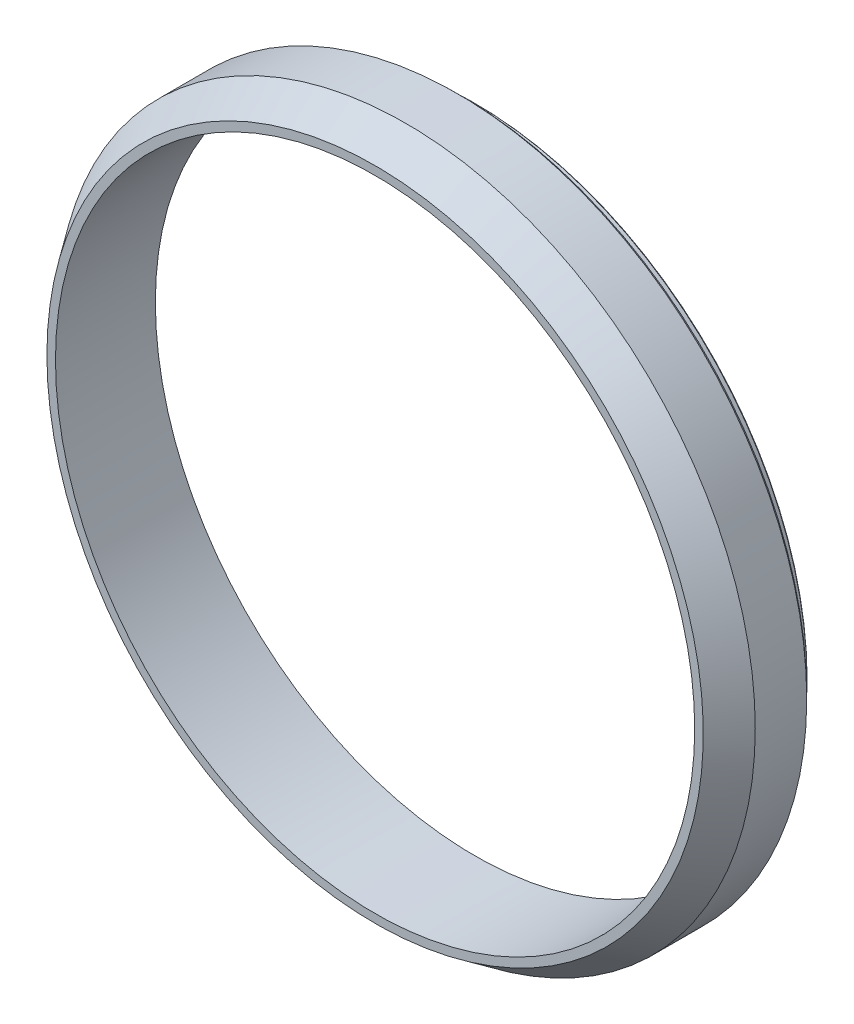
ISO-10303-21;
HEADER;
FILE_DESCRIPTION(('STEP AP214'),'2;1');
FILE_NAME('part.step','',(''),(''),'','','');
FILE_SCHEMA(('AUTOMOTIVE_DESIGN { 1 0 10303 214 1 1 1 1 }'));
ENDSEC;
DATA;
#1=APPLICATION_CONTEXT('core data for automotive mechanical design processes');
#2=APPLICATION_PROTOCOL_DEFINITION('international standard','automotive_design',2000,#1);
#3=PRODUCT_CONTEXT('',#1,'mechanical');
#4=PRODUCT('Part','Part','',(#3));
#5=PRODUCT_RELATED_PRODUCT_CATEGORY('part','',(#4));
#6=PRODUCT_DEFINITION_FORMATION('','',#4);
#7=PRODUCT_DEFINITION_CONTEXT('part definition',#1,'design');
#8=PRODUCT_DEFINITION('design','',#6,#7);
#9=PRODUCT_DEFINITION_SHAPE('','',#8);
#10=(LENGTH_UNIT() NAMED_UNIT(*) SI_UNIT(.MILLI.,.METRE.));
#11=(NAMED_UNIT(*) PLANE_ANGLE_UNIT() SI_UNIT($,.RADIAN.));
#12=(NAMED_UNIT(*) SI_UNIT($,.STERADIAN.) SOLID_ANGLE_UNIT());
#13=UNCERTAINTY_MEASURE_WITH_UNIT(LENGTH_MEASURE(1.E-05),#10,'distance_accuracy_value','');
#14=(GEOMETRIC_REPRESENTATION_CONTEXT(3) GLOBAL_UNCERTAINTY_ASSIGNED_CONTEXT((#13)) GLOBAL_UNIT_ASSIGNED_CONTEXT((#10,
#11,#12)) REPRESENTATION_CONTEXT('',''));
#15=CARTESIAN_POINT('',(0.,0.,0.));
#16=DIRECTION('',(0.,0.,1.));
#17=DIRECTION('',(1.,0.,0.));
#18=AXIS2_PLACEMENT_3D('',#15,#16,#17);
#19=CARTESIAN_POINT('',(46.8,0.,-14.));
#20=DIRECTION('',(0.,0.,1.));
#21=DIRECTION('',(1.,0.,0.));
#22=AXIS2_PLACEMENT_3D('',#19,#20,#21);
#23=PLANE('',#22);
#24=CARTESIAN_POINT('',(0.,0.,-14.));
#25=DIRECTION('',(0.,0.,1.));
#26=DIRECTION('',(1.,0.,0.));
#27=AXIS2_PLACEMENT_3D('',#24,#25,#26);
#28=CIRCLE('',#27,46.55);
#29=CARTESIAN_POINT('',(46.55,0.,-14.));
#30=VERTEX_POINT('',#29);
#31=EDGE_CURVE('E65',#30,#30,#28,.F.);
#32=ORIENTED_EDGE('',*,*,#31,.T.);
#33=EDGE_LOOP('',(#32));
#34=FACE_BOUND('',#33,.T.);
#35=CARTESIAN_POINT('',(0.,0.,-14.));
#36=DIRECTION('',(0.,0.,-1.));
#37=DIRECTION('',(-1.,0.,0.));
#38=AXIS2_PLACEMENT_3D('',#35,#36,#37);
#39=CIRCLE('',#38,44.8);
#40=CARTESIAN_POINT('',(-44.8,0.,-14.));
#41=VERTEX_POINT('',#40);
#42=EDGE_CURVE('E69',#41,#41,#39,.T.);
#43=ORIENTED_EDGE('',*,*,#42,.F.);
#44=EDGE_LOOP('',(#43));
#45=FACE_BOUND('',#44,.T.);
#46=ADVANCED_FACE('F37',(#34,#45),#23,.F.);
#47=CARTESIAN_POINT('',(0.,0.,-51.2755102040816));
#48=DIRECTION('',(0.,0.,-1.));
#49=DIRECTION('',(-1.,0.,0.));
#50=AXIS2_PLACEMENT_3D('',#47,#48,#49);
#51=CYLINDRICAL_SURFACE('',#50,44.8);
#52=CARTESIAN_POINT('',(0.,0.,0.));
#53=DIRECTION('',(0.,0.,-1.));
#54=DIRECTION('',(-1.,0.,0.));
#55=AXIS2_PLACEMENT_3D('',#52,#53,#54);
#56=CIRCLE('',#55,44.8);
#57=CARTESIAN_POINT('',(-44.8,0.,0.));
#58=VERTEX_POINT('',#57);
#59=EDGE_CURVE('E73',#58,#58,#56,.T.);
#60=ORIENTED_EDGE('',*,*,#59,.F.);
#61=EDGE_LOOP('',(#60));
#62=FACE_BOUND('',#61,.T.);
#63=ORIENTED_EDGE('',*,*,#42,.T.);
#64=EDGE_LOOP('',(#63));
#65=FACE_BOUND('',#64,.T.);
#66=ADVANCED_FACE('F99',(#62,#65),#51,.F.);
#67=CARTESIAN_POINT('',(44.8,0.,0.));
#68=DIRECTION('',(0.,0.,-1.));
#69=DIRECTION('',(-1.,0.,0.));
#70=AXIS2_PLACEMENT_3D('',#67,#68,#69);
#71=PLANE('',#70);
#72=CARTESIAN_POINT('',(0.,0.,0.));
#73=DIRECTION('',(0.,0.,-1.));
#74=DIRECTION('',(-1.,0.,0.));
#75=AXIS2_PLACEMENT_3D('',#72,#73,#74);
#76=CIRCLE('',#75,46.);
#77=CARTESIAN_POINT('',(-46.,0.,0.));
#78=VERTEX_POINT('',#77);
#79=EDGE_CURVE('E10',#78,#78,#76,.F.);
#80=ORIENTED_EDGE('',*,*,#79,.T.);
#81=EDGE_LOOP('',(#80));
#82=FACE_BOUND('',#81,.T.);
#83=ORIENTED_EDGE('',*,*,#59,.T.);
#84=EDGE_LOOP('',(#83));
#85=FACE_BOUND('',#84,.T.);
#86=ADVANCED_FACE('F96',(#82,#85),#71,.F.);
#87=CARTESIAN_POINT('',(0.,0.,-51.2755102040816));
#88=DIRECTION('',(0.,0.,-1.));
#89=DIRECTION('',(-1.,0.,0.));
#90=AXIS2_PLACEMENT_3D('',#87,#88,#89);
#91=CYLINDRICAL_SURFACE('',#90,49.);
#92=CARTESIAN_POINT('',(0.,0.,-4.28444402022632));
#93=DIRECTION('',(0.,0.,-1.));
#94=DIRECTION('',(-1.,0.,0.));
#95=AXIS2_PLACEMENT_3D('',#92,#93,#94);
#96=CIRCLE('',#95,49.);
#97=CARTESIAN_POINT('',(-49.,0.,-4.28444402022632));
#98=VERTEX_POINT('',#97);
#99=EDGE_CURVE('E45',#98,#98,#96,.T.);
#100=ORIENTED_EDGE('',*,*,#99,.T.);
#101=EDGE_LOOP('',(#100));
#102=FACE_BOUND('',#101,.T.);
#103=CARTESIAN_POINT('',(0.,0.,-11.5));
#104=DIRECTION('',(0.,0.,1.));
#105=DIRECTION('',(1.,0.,0.));
#106=AXIS2_PLACEMENT_3D('',#103,#104,#105);
#107=CIRCLE('',#106,49.);
#108=CARTESIAN_POINT('',(49.,0.,-11.5));
#109=VERTEX_POINT('',#108);
#110=EDGE_CURVE('E50',#109,#109,#107,.T.);
#111=ORIENTED_EDGE('',*,*,#110,.T.);
#112=EDGE_LOOP('',(#111));
#113=FACE_BOUND('',#112,.T.);
#114=ADVANCED_FACE('F86',(#102,#113),#91,.T.);
#115=CARTESIAN_POINT('',(49.,0.,-12.));
#116=DIRECTION('',(0.,0.,1.));
#117=DIRECTION('',(1.,0.,0.));
#118=AXIS2_PLACEMENT_3D('',#115,#116,#117);
#119=PLANE('',#118);
#120=CARTESIAN_POINT('',(0.,0.,-12.));
#121=DIRECTION('',(0.,0.,1.));
#122=DIRECTION('',(1.,0.,0.));
#123=AXIS2_PLACEMENT_3D('',#120,#121,#122);
#124=CIRCLE('',#123,48.5);
#125=CARTESIAN_POINT('',(48.5,0.,-12.));
#126=VERTEX_POINT('',#125);
#127=EDGE_CURVE('E55',#126,#126,#124,.F.);
#128=ORIENTED_EDGE('',*,*,#127,.T.);
#129=EDGE_LOOP('',(#128));
#130=FACE_BOUND('',#129,.T.);
#131=CARTESIAN_POINT('',(0.,0.,-12.));
#132=DIRECTION('',(0.,0.,-1.));
#133=DIRECTION('',(-1.,0.,0.));
#134=AXIS2_PLACEMENT_3D('',#131,#132,#133);
#135=CIRCLE('',#134,46.8);
#136=CARTESIAN_POINT('',(-46.8,0.,-12.));
#137=VERTEX_POINT('',#136);
#138=EDGE_CURVE('E77',#137,#137,#135,.T.);
#139=ORIENTED_EDGE('',*,*,#138,.F.);
#140=EDGE_LOOP('',(#139));
#141=FACE_BOUND('',#140,.T.);
#142=ADVANCED_FACE('F84',(#130,#141),#119,.F.);
#143=CARTESIAN_POINT('',(0.,0.,-51.2755102040816));
#144=DIRECTION('',(0.,0.,-1.));
#145=DIRECTION('',(-1.,0.,0.));
#146=AXIS2_PLACEMENT_3D('',#143,#144,#145);
#147=CYLINDRICAL_SURFACE('',#146,46.8);
#148=CARTESIAN_POINT('',(0.,0.,-13.75));
#149=DIRECTION('',(0.,0.,1.));
#150=DIRECTION('',(1.,0.,0.));
#151=AXIS2_PLACEMENT_3D('',#148,#149,#150);
#152=CIRCLE('',#151,46.8);
#153=CARTESIAN_POINT('',(46.8,0.,-13.75));
#154=VERTEX_POINT('',#153);
#155=EDGE_CURVE('E61',#154,#154,#152,.T.);
#156=ORIENTED_EDGE('',*,*,#155,.T.);
#157=EDGE_LOOP('',(#156));
#158=FACE_BOUND('',#157,.T.);
#159=ORIENTED_EDGE('',*,*,#138,.T.);
#160=EDGE_LOOP('',(#159));
#161=FACE_BOUND('',#160,.T.);
#162=ADVANCED_FACE('F82',(#158,#161),#147,.T.);
#163=CARTESIAN_POINT('',(0.,0.,-14.));
#164=DIRECTION('',(0.,0.,1.));
#165=DIRECTION('',(1.,0.,0.));
#166=AXIS2_PLACEMENT_3D('',#163,#164,#165);
#167=CONICAL_SURFACE('',#166,46.55,0.785398163397435);
#168=ORIENTED_EDGE('',*,*,#155,.F.);
#169=EDGE_LOOP('',(#168));
#170=FACE_BOUND('',#169,.T.);
#171=ORIENTED_EDGE('',*,*,#31,.F.);
#172=EDGE_LOOP('',(#171));
#173=FACE_BOUND('',#172,.T.);
#174=ADVANCED_FACE('F93',(#170,#173),#167,.T.);
#175=CARTESIAN_POINT('',(0.,0.,-12.));
#176=DIRECTION('',(0.,0.,1.));
#177=DIRECTION('',(1.,0.,0.));
#178=AXIS2_PLACEMENT_3D('',#175,#176,#177);
#179=CONICAL_SURFACE('',#178,48.5,0.785398163397462);
#180=ORIENTED_EDGE('',*,*,#110,.F.);
#181=EDGE_LOOP('',(#180));
#182=FACE_BOUND('',#181,.T.);
#183=ORIENTED_EDGE('',*,*,#127,.F.);
#184=EDGE_LOOP('',(#183));
#185=FACE_BOUND('',#184,.T.);
#186=ADVANCED_FACE('F111',(#182,#185),#179,.T.);
#187=CARTESIAN_POINT('',(0.,0.,-4.28444402022632));
#188=DIRECTION('',(0.,0.,-1.));
#189=DIRECTION('',(-1.,0.,0.));
#190=AXIS2_PLACEMENT_3D('',#187,#188,#189);
#191=CONICAL_SURFACE('',#190,49.,0.610865238198016);
#192=ORIENTED_EDGE('',*,*,#79,.F.);
#193=EDGE_LOOP('',(#192));
#194=FACE_BOUND('',#193,.T.);
#195=ORIENTED_EDGE('',*,*,#99,.F.);
#196=EDGE_LOOP('',(#195));
#197=FACE_BOUND('',#196,.T.);
#198=ADVANCED_FACE('F39',(#194,#197),#191,.T.);
#199=CLOSED_SHELL('',(#46,#66,#86,#114,#142,#162,#174,#186,#198));
#200=MANIFOLD_SOLID_BREP('B2',#199);
#201=ADVANCED_BREP_SHAPE_REPRESENTATION('',(#18,#200),#14);
#202=SHAPE_DEFINITION_REPRESENTATION(#9,#201);
ENDSEC;
END-ISO-10303-21;
